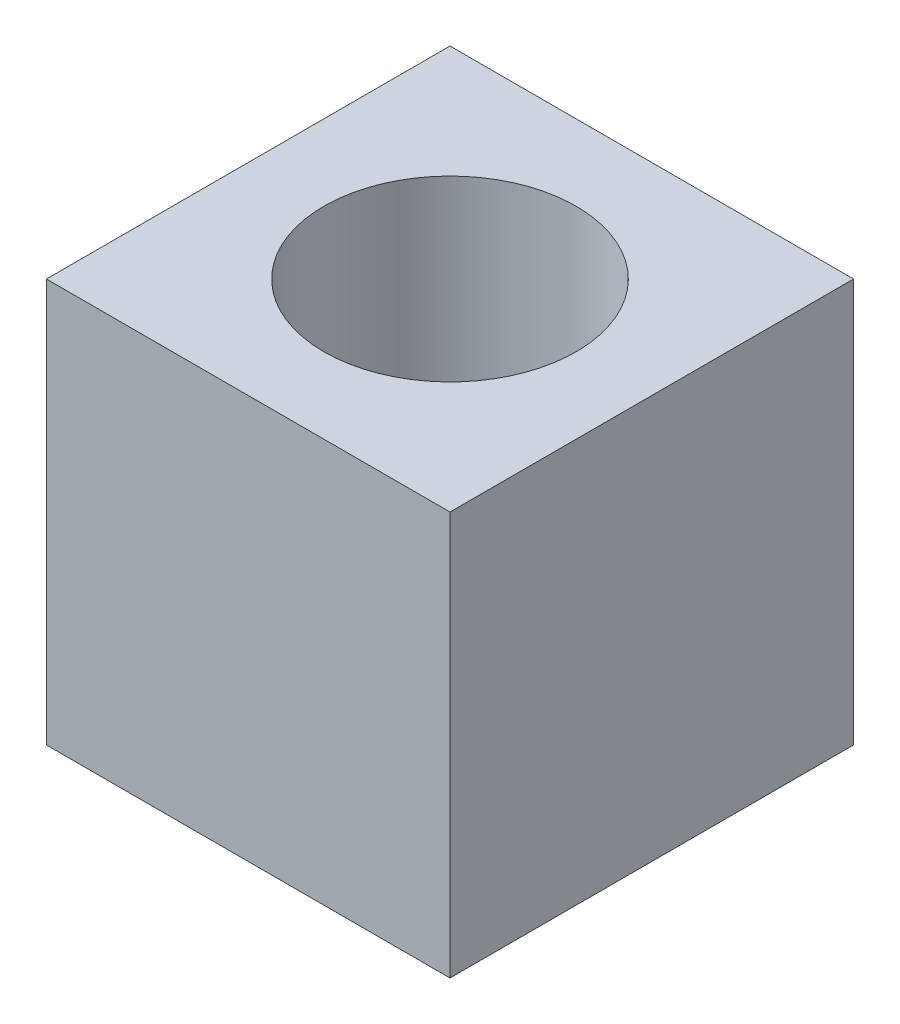
ISO-10303-21;
HEADER;
FILE_DESCRIPTION(('STEP AP214'),'2;1');
FILE_NAME('part.step','',(''),(''),'','','');
FILE_SCHEMA(('AUTOMOTIVE_DESIGN { 1 0 10303 214 1 1 1 1 }'));
ENDSEC;
DATA;
#1=APPLICATION_CONTEXT('core data for automotive mechanical design processes');
#2=APPLICATION_PROTOCOL_DEFINITION('international standard','automotive_design',2000,#1);
#3=PRODUCT_CONTEXT('',#1,'mechanical');
#4=PRODUCT('Part','Part','',(#3));
#5=PRODUCT_RELATED_PRODUCT_CATEGORY('part','',(#4));
#6=PRODUCT_DEFINITION_FORMATION('','',#4);
#7=PRODUCT_DEFINITION_CONTEXT('part definition',#1,'design');
#8=PRODUCT_DEFINITION('design','',#6,#7);
#9=PRODUCT_DEFINITION_SHAPE('','',#8);
#10=(LENGTH_UNIT() NAMED_UNIT(*) SI_UNIT(.MILLI.,.METRE.));
#11=(NAMED_UNIT(*) PLANE_ANGLE_UNIT() SI_UNIT($,.RADIAN.));
#12=(NAMED_UNIT(*) SI_UNIT($,.STERADIAN.) SOLID_ANGLE_UNIT());
#13=UNCERTAINTY_MEASURE_WITH_UNIT(LENGTH_MEASURE(1.E-05),#10,'distance_accuracy_value','');
#14=(GEOMETRIC_REPRESENTATION_CONTEXT(3) GLOBAL_UNCERTAINTY_ASSIGNED_CONTEXT((#13)) GLOBAL_UNIT_ASSIGNED_CONTEXT((#10,
#11,#12)) REPRESENTATION_CONTEXT('',''));
#15=CARTESIAN_POINT('',(0.,0.,0.));
#16=DIRECTION('',(0.,0.,1.));
#17=DIRECTION('',(1.,0.,0.));
#18=AXIS2_PLACEMENT_3D('',#15,#16,#17);
#19=CARTESIAN_POINT('',(20.,-20.,20.));
#20=DIRECTION('',(-1.,0.,0.));
#21=DIRECTION('',(0.,0.,1.));
#22=AXIS2_PLACEMENT_3D('',#19,#20,#21);
#23=PLANE('',#22);
#24=DIRECTION('',(0.,1.,0.));
#25=VECTOR('',#24,1.);
#26=CARTESIAN_POINT('',(20.,-20.,-20.));
#27=LINE('',#26,#25);
#28=CARTESIAN_POINT('',(20.,-20.,-20.));
#29=VERTEX_POINT('',#28);
#30=CARTESIAN_POINT('',(20.,20.,-20.));
#31=VERTEX_POINT('',#30);
#32=EDGE_CURVE('E107',#29,#31,#27,.T.);
#33=ORIENTED_EDGE('',*,*,#32,.T.);
#34=DIRECTION('',(0.,0.,-1.));
#35=VECTOR('',#34,1.);
#36=CARTESIAN_POINT('',(20.,20.,20.));
#37=LINE('',#36,#35);
#38=CARTESIAN_POINT('',(20.,20.,20.));
#39=VERTEX_POINT('',#38);
#40=EDGE_CURVE('E11',#39,#31,#37,.T.);
#41=ORIENTED_EDGE('',*,*,#40,.F.);
#42=DIRECTION('',(0.,1.,0.));
#43=VECTOR('',#42,1.);
#44=CARTESIAN_POINT('',(20.,-20.,20.));
#45=LINE('',#44,#43);
#46=CARTESIAN_POINT('',(20.,-20.,20.));
#47=VERTEX_POINT('',#46);
#48=EDGE_CURVE('E91',#47,#39,#45,.T.);
#49=ORIENTED_EDGE('',*,*,#48,.F.);
#50=DIRECTION('',(0.,0.,-1.));
#51=VECTOR('',#50,1.);
#52=CARTESIAN_POINT('',(20.,-20.,20.));
#53=LINE('',#52,#51);
#54=EDGE_CURVE('E103',#47,#29,#53,.T.);
#55=ORIENTED_EDGE('',*,*,#54,.T.);
#56=EDGE_LOOP('',(#33,#41,#49,#55));
#57=FACE_BOUND('',#56,.T.);
#58=ADVANCED_FACE('F39',(#57),#23,.F.);
#59=CARTESIAN_POINT('',(-20.,20.,20.));
#60=DIRECTION('',(0.,-1.,0.));
#61=DIRECTION('',(0.,0.,-1.));
#62=AXIS2_PLACEMENT_3D('',#59,#60,#61);
#63=PLANE('',#62);
#64=CARTESIAN_POINT('',(0.,20.,0.));
#65=DIRECTION('',(0.,1.,0.));
#66=DIRECTION('',(0.,0.,1.));
#67=AXIS2_PLACEMENT_3D('',#64,#65,#66);
#68=CIRCLE('',#67,12.5);
#69=CARTESIAN_POINT('',(0.,20.,12.5));
#70=VERTEX_POINT('',#69);
#71=EDGE_CURVE('E131',#70,#70,#68,.T.);
#72=ORIENTED_EDGE('',*,*,#71,.F.);
#73=EDGE_LOOP('',(#72));
#74=FACE_BOUND('',#73,.T.);
#75=DIRECTION('',(-1.,0.,0.));
#76=VECTOR('',#75,1.);
#77=CARTESIAN_POINT('',(-20.,20.,-20.));
#78=LINE('',#77,#76);
#79=CARTESIAN_POINT('',(-20.,20.,-20.));
#80=VERTEX_POINT('',#79);
#81=EDGE_CURVE('E96',#31,#80,#78,.T.);
#82=ORIENTED_EDGE('',*,*,#81,.T.);
#83=DIRECTION('',(0.,0.,-1.));
#84=VECTOR('',#83,1.);
#85=CARTESIAN_POINT('',(-20.,20.,20.));
#86=LINE('',#85,#84);
#87=CARTESIAN_POINT('',(-20.,20.,20.));
#88=VERTEX_POINT('',#87);
#89=EDGE_CURVE('E48',#88,#80,#86,.T.);
#90=ORIENTED_EDGE('',*,*,#89,.F.);
#91=DIRECTION('',(-1.,0.,0.));
#92=VECTOR('',#91,1.);
#93=CARTESIAN_POINT('',(-20.,20.,20.));
#94=LINE('',#93,#92);
#95=EDGE_CURVE('E86',#39,#88,#94,.T.);
#96=ORIENTED_EDGE('',*,*,#95,.F.);
#97=ORIENTED_EDGE('',*,*,#40,.T.);
#98=EDGE_LOOP('',(#82,#90,#96,#97));
#99=FACE_BOUND('',#98,.T.);
#100=ADVANCED_FACE('F95',(#74,#99),#63,.F.);
#101=CARTESIAN_POINT('',(-20.,-20.,20.));
#102=DIRECTION('',(1.,0.,0.));
#103=DIRECTION('',(0.,0.,-1.));
#104=AXIS2_PLACEMENT_3D('',#101,#102,#103);
#105=PLANE('',#104);
#106=DIRECTION('',(0.,-1.,0.));
#107=VECTOR('',#106,1.);
#108=CARTESIAN_POINT('',(-20.,-20.,-20.));
#109=LINE('',#108,#107);
#110=CARTESIAN_POINT('',(-20.,-20.,-20.));
#111=VERTEX_POINT('',#110);
#112=EDGE_CURVE('E73',#80,#111,#109,.T.);
#113=ORIENTED_EDGE('',*,*,#112,.T.);
#114=DIRECTION('',(0.,0.,-1.));
#115=VECTOR('',#114,1.);
#116=CARTESIAN_POINT('',(-20.,-20.,20.));
#117=LINE('',#116,#115);
#118=CARTESIAN_POINT('',(-20.,-20.,20.));
#119=VERTEX_POINT('',#118);
#120=EDGE_CURVE('E98',#119,#111,#117,.T.);
#121=ORIENTED_EDGE('',*,*,#120,.F.);
#122=DIRECTION('',(0.,-1.,0.));
#123=VECTOR('',#122,1.);
#124=CARTESIAN_POINT('',(-20.,-20.,20.));
#125=LINE('',#124,#123);
#126=EDGE_CURVE('E89',#88,#119,#125,.T.);
#127=ORIENTED_EDGE('',*,*,#126,.F.);
#128=ORIENTED_EDGE('',*,*,#89,.T.);
#129=EDGE_LOOP('',(#113,#121,#127,#128));
#130=FACE_BOUND('',#129,.T.);
#131=ADVANCED_FACE('F99',(#130),#105,.F.);
#132=CARTESIAN_POINT('',(-20.,-20.,20.));
#133=DIRECTION('',(0.,1.,0.));
#134=DIRECTION('',(0.,0.,1.));
#135=AXIS2_PLACEMENT_3D('',#132,#133,#134);
#136=PLANE('',#135);
#137=CARTESIAN_POINT('',(0.,-20.,0.));
#138=DIRECTION('',(0.,1.,0.));
#139=DIRECTION('',(0.,0.,1.));
#140=AXIS2_PLACEMENT_3D('',#137,#138,#139);
#141=CIRCLE('',#140,12.5);
#142=CARTESIAN_POINT('',(0.,-20.,12.5));
#143=VERTEX_POINT('',#142);
#144=EDGE_CURVE('E111',#143,#143,#141,.T.);
#145=ORIENTED_EDGE('',*,*,#144,.T.);
#146=EDGE_LOOP('',(#145));
#147=FACE_BOUND('',#146,.T.);
#148=DIRECTION('',(1.,0.,0.));
#149=VECTOR('',#148,1.);
#150=CARTESIAN_POINT('',(-20.,-20.,-20.));
#151=LINE('',#150,#149);
#152=EDGE_CURVE('E79',#111,#29,#151,.T.);
#153=ORIENTED_EDGE('',*,*,#152,.T.);
#154=ORIENTED_EDGE('',*,*,#54,.F.);
#155=DIRECTION('',(1.,0.,0.));
#156=VECTOR('',#155,1.);
#157=CARTESIAN_POINT('',(-20.,-20.,20.));
#158=LINE('',#157,#156);
#159=EDGE_CURVE('E56',#119,#47,#158,.T.);
#160=ORIENTED_EDGE('',*,*,#159,.F.);
#161=ORIENTED_EDGE('',*,*,#120,.T.);
#162=EDGE_LOOP('',(#153,#154,#160,#161));
#163=FACE_BOUND('',#162,.T.);
#164=ADVANCED_FACE('F121',(#147,#163),#136,.F.);
#165=CARTESIAN_POINT('',(0.,0.,20.));
#166=DIRECTION('',(0.,0.,-1.));
#167=DIRECTION('',(-1.,0.,0.));
#168=AXIS2_PLACEMENT_3D('',#165,#166,#167);
#169=PLANE('',#168);
#170=ORIENTED_EDGE('',*,*,#48,.T.);
#171=ORIENTED_EDGE('',*,*,#95,.T.);
#172=ORIENTED_EDGE('',*,*,#126,.T.);
#173=ORIENTED_EDGE('',*,*,#159,.T.);
#174=EDGE_LOOP('',(#170,#171,#172,#173));
#175=FACE_BOUND('',#174,.T.);
#176=ADVANCED_FACE('F87',(#175),#169,.F.);
#177=CARTESIAN_POINT('',(0.,0.,-20.));
#178=DIRECTION('',(0.,0.,-1.));
#179=DIRECTION('',(-1.,0.,0.));
#180=AXIS2_PLACEMENT_3D('',#177,#178,#179);
#181=PLANE('',#180);
#182=ORIENTED_EDGE('',*,*,#32,.F.);
#183=ORIENTED_EDGE('',*,*,#152,.F.);
#184=ORIENTED_EDGE('',*,*,#112,.F.);
#185=ORIENTED_EDGE('',*,*,#81,.F.);
#186=EDGE_LOOP('',(#182,#183,#184,#185));
#187=FACE_BOUND('',#186,.T.);
#188=ADVANCED_FACE('F124',(#187),#181,.T.);
#189=CARTESIAN_POINT('',(0.,-20.,0.));
#190=DIRECTION('',(0.,1.,0.));
#191=DIRECTION('',(0.,0.,1.));
#192=AXIS2_PLACEMENT_3D('',#189,#190,#191);
#193=CYLINDRICAL_SURFACE('',#192,12.5);
#194=ORIENTED_EDGE('',*,*,#144,.F.);
#195=EDGE_LOOP('',(#194));
#196=FACE_BOUND('',#195,.T.);
#197=ORIENTED_EDGE('',*,*,#71,.T.);
#198=EDGE_LOOP('',(#197));
#199=FACE_BOUND('',#198,.T.);
#200=ADVANCED_FACE('F136',(#196,#199),#193,.F.);
#201=CLOSED_SHELL('',(#58,#100,#131,#164,#176,#188,#200));
#202=MANIFOLD_SOLID_BREP('B2',#201);
#203=ADVANCED_BREP_SHAPE_REPRESENTATION('',(#18,#202),#14);
#204=SHAPE_DEFINITION_REPRESENTATION(#9,#203);
ENDSEC;
END-ISO-10303-21;
